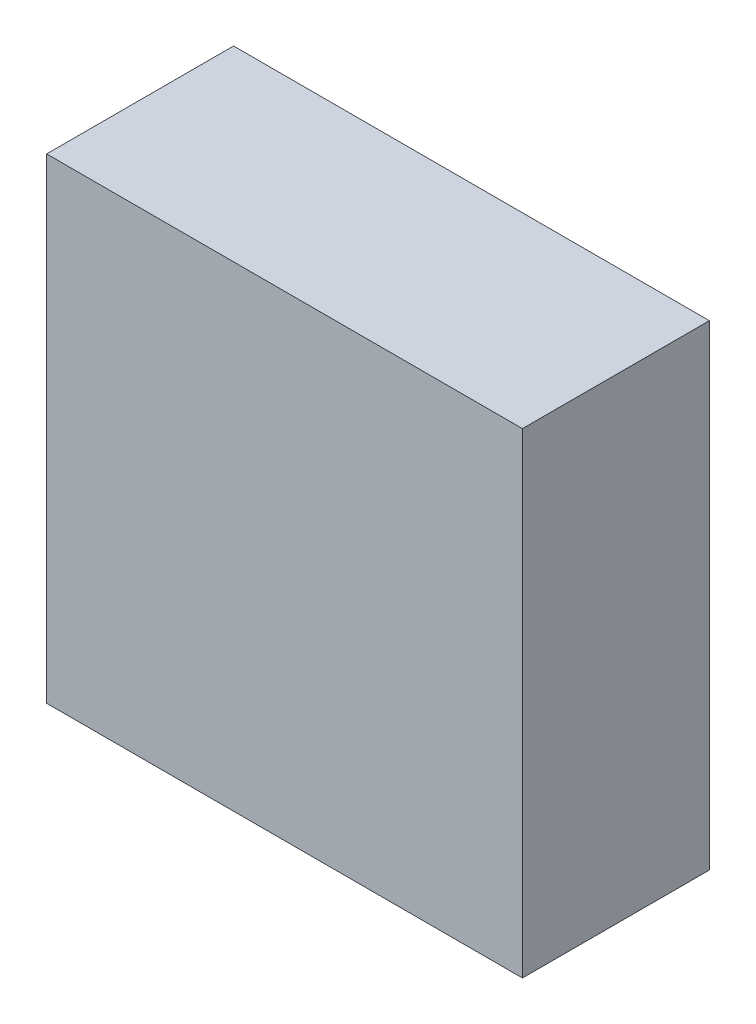
ISO-10303-21;
HEADER;
FILE_DESCRIPTION(('STEP AP214'),'2;1');
FILE_NAME('part.step','',(''),(''),'','','');
FILE_SCHEMA(('AUTOMOTIVE_DESIGN { 1 0 10303 214 1 1 1 1 }'));
ENDSEC;
DATA;
#1=APPLICATION_CONTEXT('core data for automotive mechanical design processes');
#2=APPLICATION_PROTOCOL_DEFINITION('international standard','automotive_design',2000,#1);
#3=PRODUCT_CONTEXT('',#1,'mechanical');
#4=PRODUCT('Part','Part','',(#3));
#5=PRODUCT_RELATED_PRODUCT_CATEGORY('part','',(#4));
#6=PRODUCT_DEFINITION_FORMATION('','',#4);
#7=PRODUCT_DEFINITION_CONTEXT('part definition',#1,'design');
#8=PRODUCT_DEFINITION('design','',#6,#7);
#9=PRODUCT_DEFINITION_SHAPE('','',#8);
#10=(LENGTH_UNIT() NAMED_UNIT(*) SI_UNIT(.MILLI.,.METRE.));
#11=(NAMED_UNIT(*) PLANE_ANGLE_UNIT() SI_UNIT($,.RADIAN.));
#12=(NAMED_UNIT(*) SI_UNIT($,.STERADIAN.) SOLID_ANGLE_UNIT());
#13=UNCERTAINTY_MEASURE_WITH_UNIT(LENGTH_MEASURE(1.E-05),#10,'distance_accuracy_value','');
#14=(GEOMETRIC_REPRESENTATION_CONTEXT(3) GLOBAL_UNCERTAINTY_ASSIGNED_CONTEXT((#13)) GLOBAL_UNIT_ASSIGNED_CONTEXT((#10,
#11,#12)) REPRESENTATION_CONTEXT('',''));
#15=CARTESIAN_POINT('',(0.,0.,0.));
#16=DIRECTION('',(0.,0.,1.));
#17=DIRECTION('',(1.,0.,0.));
#18=AXIS2_PLACEMENT_3D('',#15,#16,#17);
#19=CARTESIAN_POINT('',(-0.70000368,0.6999986,0.5499989));
#20=DIRECTION('',(0.,0.,-1.));
#21=DIRECTION('',(-1.,0.,0.));
#22=AXIS2_PLACEMENT_3D('',#19,#20,#21);
#23=PLANE('',#22);
#24=DIRECTION('',(0.999999999993417,3.62855893165251E-06,0.));
#25=VECTOR('',#24,1.);
#26=CARTESIAN_POINT('',(-0.699998600009223,-0.700003680000001,0.5499989));
#27=LINE('',#26,#25);
#28=CARTESIAN_POINT('',(-0.699998600000006,-0.700003680000001,0.5499989));
#29=VERTEX_POINT('',#28);
#30=CARTESIAN_POINT('',(0.70000622,-0.699998600000006,0.5499989));
#31=VERTEX_POINT('',#30);
#32=EDGE_CURVE('E59',#29,#31,#27,.T.);
#33=ORIENTED_EDGE('',*,*,#32,.T.);
#34=DIRECTION('',(-5.44284828242802E-06,0.999999999985188,0.));
#35=VECTOR('',#34,1.);
#36=CARTESIAN_POINT('',(0.69999859998617,0.700006220000005,0.5499989));
#37=LINE('',#36,#35);
#38=CARTESIAN_POINT('',(0.699998599999995,0.70000368,0.5499989));
#39=VERTEX_POINT('',#38);
#40=EDGE_CURVE('E56',#31,#39,#37,.T.);
#41=ORIENTED_EDGE('',*,*,#40,.T.);
#42=DIRECTION('',(-0.999999999993417,-3.62856552503451E-06,0.));
#43=VECTOR('',#42,1.);
#44=CARTESIAN_POINT('',(-0.70000368,0.699998599999992,0.5499989));
#45=LINE('',#44,#43);
#46=CARTESIAN_POINT('',(-0.70000368,0.699998599999996,0.5499989));
#47=VERTEX_POINT('',#46);
#48=EDGE_CURVE('E20',#39,#47,#45,.T.);
#49=ORIENTED_EDGE('',*,*,#48,.T.);
#50=DIRECTION('',(3.62856551488351E-06,-0.999999999993417,0.));
#51=VECTOR('',#50,1.);
#52=CARTESIAN_POINT('',(-0.70000368,0.6999986,0.5499989));
#53=LINE('',#52,#51);
#54=EDGE_CURVE('E85',#47,#29,#53,.T.);
#55=ORIENTED_EDGE('',*,*,#54,.T.);
#56=EDGE_LOOP('',(#33,#41,#49,#55));
#57=FACE_BOUND('',#56,.T.);
#58=ADVANCED_FACE('F17',(#57),#23,.F.);
#59=CARTESIAN_POINT('',(0.6999986,0.70000368,0.));
#60=DIRECTION('',(3.62856552503451E-06,-0.999999999993417,0.));
#61=DIRECTION('',(0.999999999993417,3.62856552503451E-06,0.));
#62=AXIS2_PLACEMENT_3D('',#59,#60,#61);
#63=PLANE('',#62);
#64=DIRECTION('',(0.,0.,1.));
#65=VECTOR('',#64,1.);
#66=CARTESIAN_POINT('',(-0.70000368,0.6999986,0.));
#67=LINE('',#66,#65);
#68=CARTESIAN_POINT('',(-0.70000368,0.699998599999996,0.));
#69=VERTEX_POINT('',#68);
#70=EDGE_CURVE('E68',#69,#47,#67,.T.);
#71=ORIENTED_EDGE('',*,*,#70,.T.);
#72=ORIENTED_EDGE('',*,*,#48,.F.);
#73=DIRECTION('',(0.,0.,1.));
#74=VECTOR('',#73,1.);
#75=CARTESIAN_POINT('',(0.699998599999995,0.70000368,0.));
#76=LINE('',#75,#74);
#77=CARTESIAN_POINT('',(0.699998599999995,0.70000368,0.));
#78=VERTEX_POINT('',#77);
#79=EDGE_CURVE('E63',#39,#78,#76,.F.);
#80=ORIENTED_EDGE('',*,*,#79,.T.);
#81=DIRECTION('',(0.999999999993417,3.62856552503451E-06,0.));
#82=VECTOR('',#81,1.);
#83=CARTESIAN_POINT('',(0.6999986,0.70000368,0.));
#84=LINE('',#83,#82);
#85=EDGE_CURVE('E83',#69,#78,#84,.T.);
#86=ORIENTED_EDGE('',*,*,#85,.F.);
#87=EDGE_LOOP('',(#71,#72,#80,#86));
#88=FACE_BOUND('',#87,.T.);
#89=ADVANCED_FACE('F65',(#88),#63,.F.);
#90=CARTESIAN_POINT('',(0.70000622,-0.6999986,0.));
#91=DIRECTION('',(-0.999999999985188,-5.44284828242802E-06,0.));
#92=DIRECTION('',(5.44284828242802E-06,-0.999999999985188,0.));
#93=AXIS2_PLACEMENT_3D('',#90,#91,#92);
#94=PLANE('',#93);
#95=ORIENTED_EDGE('',*,*,#79,.F.);
#96=ORIENTED_EDGE('',*,*,#40,.F.);
#97=DIRECTION('',(0.,0.,1.));
#98=VECTOR('',#97,1.);
#99=CARTESIAN_POINT('',(0.70000622,-0.699998600000006,0.));
#100=LINE('',#99,#98);
#101=CARTESIAN_POINT('',(0.70000622,-0.699998600000006,0.));
#102=VERTEX_POINT('',#101);
#103=EDGE_CURVE('E75',#31,#102,#100,.F.);
#104=ORIENTED_EDGE('',*,*,#103,.T.);
#105=DIRECTION('',(5.44284828242802E-06,-0.999999999985188,0.));
#106=VECTOR('',#105,1.);
#107=CARTESIAN_POINT('',(0.70000622,-0.6999986,0.));
#108=LINE('',#107,#106);
#109=EDGE_CURVE('E72',#78,#102,#108,.T.);
#110=ORIENTED_EDGE('',*,*,#109,.F.);
#111=EDGE_LOOP('',(#95,#96,#104,#110));
#112=FACE_BOUND('',#111,.T.);
#113=ADVANCED_FACE('F70',(#112),#94,.F.);
#114=CARTESIAN_POINT('',(-0.6999986,-0.70000368,0.));
#115=DIRECTION('',(-3.62855893165251E-06,0.999999999993417,0.));
#116=DIRECTION('',(-0.999999999993417,-3.62855893165251E-06,0.));
#117=AXIS2_PLACEMENT_3D('',#114,#115,#116);
#118=PLANE('',#117);
#119=ORIENTED_EDGE('',*,*,#103,.F.);
#120=ORIENTED_EDGE('',*,*,#32,.F.);
#121=DIRECTION('',(0.,0.,1.));
#122=VECTOR('',#121,1.);
#123=CARTESIAN_POINT('',(-0.699998600000006,-0.700003680000001,0.));
#124=LINE('',#123,#122);
#125=CARTESIAN_POINT('',(-0.699998600000006,-0.700003680000001,0.));
#126=VERTEX_POINT('',#125);
#127=EDGE_CURVE('E35',#29,#126,#124,.F.);
#128=ORIENTED_EDGE('',*,*,#127,.T.);
#129=DIRECTION('',(-0.999999999993417,-3.62855893165251E-06,0.));
#130=VECTOR('',#129,1.);
#131=CARTESIAN_POINT('',(-0.6999986,-0.70000368,0.));
#132=LINE('',#131,#130);
#133=EDGE_CURVE('E26',#102,#126,#132,.T.);
#134=ORIENTED_EDGE('',*,*,#133,.F.);
#135=EDGE_LOOP('',(#119,#120,#128,#134));
#136=FACE_BOUND('',#135,.T.);
#137=ADVANCED_FACE('F87',(#136),#118,.F.);
#138=CARTESIAN_POINT('',(-0.70000368,0.6999986,0.));
#139=DIRECTION('',(0.999999999993417,3.62856551488351E-06,0.));
#140=DIRECTION('',(-3.62856551488351E-06,0.999999999993417,0.));
#141=AXIS2_PLACEMENT_3D('',#138,#139,#140);
#142=PLANE('',#141);
#143=ORIENTED_EDGE('',*,*,#127,.F.);
#144=ORIENTED_EDGE('',*,*,#54,.F.);
#145=ORIENTED_EDGE('',*,*,#70,.F.);
#146=DIRECTION('',(-3.62856551488351E-06,0.999999999993417,0.));
#147=VECTOR('',#146,1.);
#148=CARTESIAN_POINT('',(-0.70000368,0.6999986,0.));
#149=LINE('',#148,#147);
#150=EDGE_CURVE('E11',#126,#69,#149,.T.);
#151=ORIENTED_EDGE('',*,*,#150,.F.);
#152=EDGE_LOOP('',(#143,#144,#145,#151));
#153=FACE_BOUND('',#152,.T.);
#154=ADVANCED_FACE('F91',(#153),#142,.F.);
#155=CARTESIAN_POINT('',(-0.70000368,0.6999986,0.));
#156=DIRECTION('',(0.,0.,-1.));
#157=DIRECTION('',(-1.,0.,0.));
#158=AXIS2_PLACEMENT_3D('',#155,#156,#157);
#159=PLANE('',#158);
#160=ORIENTED_EDGE('',*,*,#133,.T.);
#161=ORIENTED_EDGE('',*,*,#150,.T.);
#162=ORIENTED_EDGE('',*,*,#85,.T.);
#163=ORIENTED_EDGE('',*,*,#109,.T.);
#164=EDGE_LOOP('',(#160,#161,#162,#163));
#165=FACE_BOUND('',#164,.T.);
#166=ADVANCED_FACE('F89',(#165),#159,.T.);
#167=CLOSED_SHELL('',(#58,#89,#113,#137,#154,#166));
#168=MANIFOLD_SOLID_BREP('B1',#167);
#169=ADVANCED_BREP_SHAPE_REPRESENTATION('',(#18,#168),#14);
#170=SHAPE_DEFINITION_REPRESENTATION(#9,#169);
ENDSEC;
END-ISO-10303-21;
